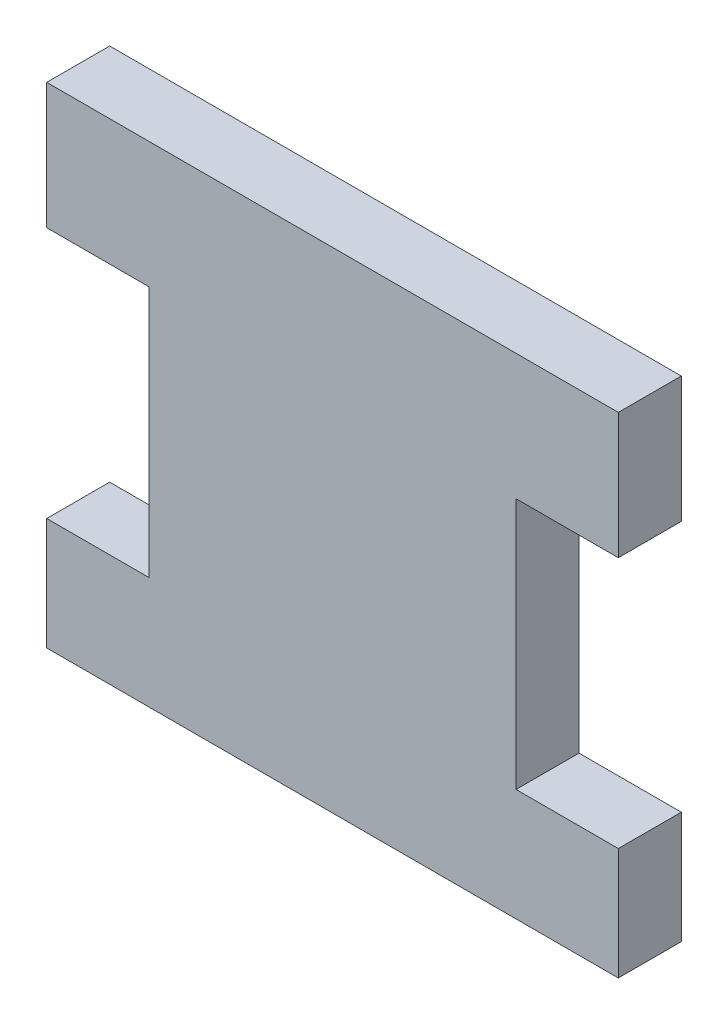
ISO-10303-21;
HEADER;
FILE_DESCRIPTION(('STEP AP214'),'2;1');
FILE_NAME('part.step','',(''),(''),'','','');
FILE_SCHEMA(('AUTOMOTIVE_DESIGN { 1 0 10303 214 1 1 1 1 }'));
ENDSEC;
DATA;
#1=APPLICATION_CONTEXT('core data for automotive mechanical design processes');
#2=APPLICATION_PROTOCOL_DEFINITION('international standard','automotive_design',2000,#1);
#3=PRODUCT_CONTEXT('',#1,'mechanical');
#4=PRODUCT('Part','Part','',(#3));
#5=PRODUCT_RELATED_PRODUCT_CATEGORY('part','',(#4));
#6=PRODUCT_DEFINITION_FORMATION('','',#4);
#7=PRODUCT_DEFINITION_CONTEXT('part definition',#1,'design');
#8=PRODUCT_DEFINITION('design','',#6,#7);
#9=PRODUCT_DEFINITION_SHAPE('','',#8);
#10=(LENGTH_UNIT() NAMED_UNIT(*) SI_UNIT(.MILLI.,.METRE.));
#11=(NAMED_UNIT(*) PLANE_ANGLE_UNIT() SI_UNIT($,.RADIAN.));
#12=(NAMED_UNIT(*) SI_UNIT($,.STERADIAN.) SOLID_ANGLE_UNIT());
#13=UNCERTAINTY_MEASURE_WITH_UNIT(LENGTH_MEASURE(1.E-05),#10,'distance_accuracy_value','');
#14=(GEOMETRIC_REPRESENTATION_CONTEXT(3) GLOBAL_UNCERTAINTY_ASSIGNED_CONTEXT((#13)) GLOBAL_UNIT_ASSIGNED_CONTEXT((#10,
#11,#12)) REPRESENTATION_CONTEXT('',''));
#15=CARTESIAN_POINT('',(0.,0.,0.));
#16=DIRECTION('',(0.,0.,1.));
#17=DIRECTION('',(1.,0.,0.));
#18=AXIS2_PLACEMENT_3D('',#15,#16,#17);
#19=CARTESIAN_POINT('',(1.135,-0.46875,0.25));
#20=DIRECTION('',(0.,-1.,0.));
#21=DIRECTION('',(0.,0.,-1.));
#22=AXIS2_PLACEMENT_3D('',#19,#20,#21);
#23=PLANE('',#22);
#24=DIRECTION('',(-1.,0.,0.));
#25=VECTOR('',#24,1.);
#26=CARTESIAN_POINT('',(1.135,-0.46875,0.));
#27=LINE('',#26,#25);
#28=CARTESIAN_POINT('',(1.135,-0.46875,0.));
#29=VERTEX_POINT('',#28);
#30=CARTESIAN_POINT('',(0.72875,-0.46875,0.));
#31=VERTEX_POINT('',#30);
#32=EDGE_CURVE('E164',#29,#31,#27,.T.);
#33=ORIENTED_EDGE('',*,*,#32,.T.);
#34=DIRECTION('',(0.,0.,-1.));
#35=VECTOR('',#34,1.);
#36=CARTESIAN_POINT('',(0.72875,-0.46875,0.25));
#37=LINE('',#36,#35);
#38=CARTESIAN_POINT('',(0.72875,-0.46875,0.25));
#39=VERTEX_POINT('',#38);
#40=EDGE_CURVE('E11',#39,#31,#37,.T.);
#41=ORIENTED_EDGE('',*,*,#40,.F.);
#42=DIRECTION('',(-1.,0.,0.));
#43=VECTOR('',#42,1.);
#44=CARTESIAN_POINT('',(1.135,-0.46875,0.25));
#45=LINE('',#44,#43);
#46=CARTESIAN_POINT('',(1.135,-0.46875,0.25));
#47=VERTEX_POINT('',#46);
#48=EDGE_CURVE('E198',#47,#39,#45,.T.);
#49=ORIENTED_EDGE('',*,*,#48,.F.);
#50=DIRECTION('',(0.,0.,-1.));
#51=VECTOR('',#50,1.);
#52=CARTESIAN_POINT('',(1.135,-0.46875,0.25));
#53=LINE('',#52,#51);
#54=EDGE_CURVE('E160',#47,#29,#53,.T.);
#55=ORIENTED_EDGE('',*,*,#54,.T.);
#56=EDGE_LOOP('',(#33,#41,#49,#55));
#57=FACE_BOUND('',#56,.T.);
#58=ADVANCED_FACE('F39',(#57),#23,.F.);
#59=CARTESIAN_POINT('',(0.72875,-0.46875,0.25));
#60=DIRECTION('',(-1.,0.,0.));
#61=DIRECTION('',(0.,0.,1.));
#62=AXIS2_PLACEMENT_3D('',#59,#60,#61);
#63=PLANE('',#62);
#64=DIRECTION('',(0.,1.,0.));
#65=VECTOR('',#64,1.);
#66=CARTESIAN_POINT('',(0.72875,-0.46875,0.));
#67=LINE('',#66,#65);
#68=CARTESIAN_POINT('',(0.72875,0.53125,0.));
#69=VERTEX_POINT('',#68);
#70=EDGE_CURVE('E168',#31,#69,#67,.T.);
#71=ORIENTED_EDGE('',*,*,#70,.T.);
#72=DIRECTION('',(0.,0.,-1.));
#73=VECTOR('',#72,1.);
#74=CARTESIAN_POINT('',(0.72875,0.53125,0.25));
#75=LINE('',#74,#73);
#76=CARTESIAN_POINT('',(0.72875,0.53125,0.25));
#77=VERTEX_POINT('',#76);
#78=EDGE_CURVE('E48',#77,#69,#75,.T.);
#79=ORIENTED_EDGE('',*,*,#78,.F.);
#80=DIRECTION('',(0.,1.,0.));
#81=VECTOR('',#80,1.);
#82=CARTESIAN_POINT('',(0.72875,-0.46875,0.25));
#83=LINE('',#82,#81);
#84=EDGE_CURVE('E111',#39,#77,#83,.T.);
#85=ORIENTED_EDGE('',*,*,#84,.F.);
#86=ORIENTED_EDGE('',*,*,#40,.T.);
#87=EDGE_LOOP('',(#71,#79,#85,#86));
#88=FACE_BOUND('',#87,.T.);
#89=ADVANCED_FACE('F292',(#88),#63,.F.);
#90=CARTESIAN_POINT('',(0.72875,0.53125,0.25));
#91=DIRECTION('',(0.,1.,0.));
#92=DIRECTION('',(0.,0.,1.));
#93=AXIS2_PLACEMENT_3D('',#90,#91,#92);
#94=PLANE('',#93);
#95=DIRECTION('',(1.,0.,0.));
#96=VECTOR('',#95,1.);
#97=CARTESIAN_POINT('',(0.72875,0.53125,0.));
#98=LINE('',#97,#96);
#99=CARTESIAN_POINT('',(1.135,0.53125,0.));
#100=VERTEX_POINT('',#99);
#101=EDGE_CURVE('E171',#69,#100,#98,.T.);
#102=ORIENTED_EDGE('',*,*,#101,.T.);
#103=DIRECTION('',(0.,0.,-1.));
#104=VECTOR('',#103,1.);
#105=CARTESIAN_POINT('',(1.135,0.53125,0.25));
#106=LINE('',#105,#104);
#107=CARTESIAN_POINT('',(1.135,0.53125,0.25));
#108=VERTEX_POINT('',#107);
#109=EDGE_CURVE('E225',#108,#100,#106,.T.);
#110=ORIENTED_EDGE('',*,*,#109,.F.);
#111=DIRECTION('',(1.,0.,0.));
#112=VECTOR('',#111,1.);
#113=CARTESIAN_POINT('',(0.72875,0.53125,0.25));
#114=LINE('',#113,#112);
#115=EDGE_CURVE('E235',#77,#108,#114,.T.);
#116=ORIENTED_EDGE('',*,*,#115,.F.);
#117=ORIENTED_EDGE('',*,*,#78,.T.);
#118=EDGE_LOOP('',(#102,#110,#116,#117));
#119=FACE_BOUND('',#118,.T.);
#120=ADVANCED_FACE('F233',(#119),#94,.F.);
#121=CARTESIAN_POINT('',(1.135,0.53125,0.25));
#122=DIRECTION('',(-1.,0.,0.));
#123=DIRECTION('',(0.,0.,1.));
#124=AXIS2_PLACEMENT_3D('',#121,#122,#123);
#125=PLANE('',#124);
#126=DIRECTION('',(0.,1.,0.));
#127=VECTOR('',#126,1.);
#128=CARTESIAN_POINT('',(1.135,0.53125,0.));
#129=LINE('',#128,#127);
#130=CARTESIAN_POINT('',(1.135,1.03125,0.));
#131=VERTEX_POINT('',#130);
#132=EDGE_CURVE('E174',#100,#131,#129,.T.);
#133=ORIENTED_EDGE('',*,*,#132,.T.);
#134=DIRECTION('',(0.,0.,-1.));
#135=VECTOR('',#134,1.);
#136=CARTESIAN_POINT('',(1.135,1.03125,0.25));
#137=LINE('',#136,#135);
#138=CARTESIAN_POINT('',(1.135,1.03125,0.25));
#139=VERTEX_POINT('',#138);
#140=EDGE_CURVE('E221',#139,#131,#137,.T.);
#141=ORIENTED_EDGE('',*,*,#140,.F.);
#142=DIRECTION('',(0.,1.,0.));
#143=VECTOR('',#142,1.);
#144=CARTESIAN_POINT('',(1.135,0.53125,0.25));
#145=LINE('',#144,#143);
#146=EDGE_CURVE('E254',#108,#139,#145,.T.);
#147=ORIENTED_EDGE('',*,*,#146,.F.);
#148=ORIENTED_EDGE('',*,*,#109,.T.);
#149=EDGE_LOOP('',(#133,#141,#147,#148));
#150=FACE_BOUND('',#149,.T.);
#151=ADVANCED_FACE('F244',(#150),#125,.F.);
#152=CARTESIAN_POINT('',(-1.135,1.03125,0.25));
#153=DIRECTION('',(0.,-1.,0.));
#154=DIRECTION('',(0.,0.,-1.));
#155=AXIS2_PLACEMENT_3D('',#152,#153,#154);
#156=PLANE('',#155);
#157=DIRECTION('',(-1.,0.,0.));
#158=VECTOR('',#157,1.);
#159=CARTESIAN_POINT('',(-1.135,1.03125,0.));
#160=LINE('',#159,#158);
#161=CARTESIAN_POINT('',(-1.135,1.03125,0.));
#162=VERTEX_POINT('',#161);
#163=EDGE_CURVE('E177',#131,#162,#160,.T.);
#164=ORIENTED_EDGE('',*,*,#163,.T.);
#165=DIRECTION('',(0.,0.,-1.));
#166=VECTOR('',#165,1.);
#167=CARTESIAN_POINT('',(-1.135,1.03125,0.25));
#168=LINE('',#167,#166);
#169=CARTESIAN_POINT('',(-1.135,1.03125,0.25));
#170=VERTEX_POINT('',#169);
#171=EDGE_CURVE('E217',#170,#162,#168,.T.);
#172=ORIENTED_EDGE('',*,*,#171,.F.);
#173=DIRECTION('',(-1.,0.,0.));
#174=VECTOR('',#173,1.);
#175=CARTESIAN_POINT('',(-1.135,1.03125,0.25));
#176=LINE('',#175,#174);
#177=EDGE_CURVE('E250',#139,#170,#176,.T.);
#178=ORIENTED_EDGE('',*,*,#177,.F.);
#179=ORIENTED_EDGE('',*,*,#140,.T.);
#180=EDGE_LOOP('',(#164,#172,#178,#179));
#181=FACE_BOUND('',#180,.T.);
#182=ADVANCED_FACE('F248',(#181),#156,.F.);
#183=CARTESIAN_POINT('',(-1.135,0.53125,0.25));
#184=DIRECTION('',(1.,0.,0.));
#185=DIRECTION('',(0.,0.,-1.));
#186=AXIS2_PLACEMENT_3D('',#183,#184,#185);
#187=PLANE('',#186);
#188=DIRECTION('',(0.,-1.,0.));
#189=VECTOR('',#188,1.);
#190=CARTESIAN_POINT('',(-1.135,0.53125,0.));
#191=LINE('',#190,#189);
#192=CARTESIAN_POINT('',(-1.135,0.53125,0.));
#193=VERTEX_POINT('',#192);
#194=EDGE_CURVE('E180',#162,#193,#191,.T.);
#195=ORIENTED_EDGE('',*,*,#194,.T.);
#196=DIRECTION('',(0.,0.,-1.));
#197=VECTOR('',#196,1.);
#198=CARTESIAN_POINT('',(-1.135,0.53125,0.25));
#199=LINE('',#198,#197);
#200=CARTESIAN_POINT('',(-1.135,0.53125,0.25));
#201=VERTEX_POINT('',#200);
#202=EDGE_CURVE('E213',#201,#193,#199,.T.);
#203=ORIENTED_EDGE('',*,*,#202,.F.);
#204=DIRECTION('',(0.,-1.,0.));
#205=VECTOR('',#204,1.);
#206=CARTESIAN_POINT('',(-1.135,0.53125,0.25));
#207=LINE('',#206,#205);
#208=EDGE_CURVE('E253',#170,#201,#207,.T.);
#209=ORIENTED_EDGE('',*,*,#208,.F.);
#210=ORIENTED_EDGE('',*,*,#171,.T.);
#211=EDGE_LOOP('',(#195,#203,#209,#210));
#212=FACE_BOUND('',#211,.T.);
#213=ADVANCED_FACE('F305',(#212),#187,.F.);
#214=CARTESIAN_POINT('',(-0.72875,0.53125,0.25));
#215=DIRECTION('',(0.,1.,0.));
#216=DIRECTION('',(0.,0.,1.));
#217=AXIS2_PLACEMENT_3D('',#214,#215,#216);
#218=PLANE('',#217);
#219=DIRECTION('',(1.,0.,0.));
#220=VECTOR('',#219,1.);
#221=CARTESIAN_POINT('',(-0.72875,0.53125,0.));
#222=LINE('',#221,#220);
#223=CARTESIAN_POINT('',(-0.72875,0.53125,0.));
#224=VERTEX_POINT('',#223);
#225=EDGE_CURVE('E183',#193,#224,#222,.T.);
#226=ORIENTED_EDGE('',*,*,#225,.T.);
#227=DIRECTION('',(0.,0.,-1.));
#228=VECTOR('',#227,1.);
#229=CARTESIAN_POINT('',(-0.72875,0.53125,0.25));
#230=LINE('',#229,#228);
#231=CARTESIAN_POINT('',(-0.72875,0.53125,0.25));
#232=VERTEX_POINT('',#231);
#233=EDGE_CURVE('E209',#232,#224,#230,.T.);
#234=ORIENTED_EDGE('',*,*,#233,.F.);
#235=DIRECTION('',(1.,0.,0.));
#236=VECTOR('',#235,1.);
#237=CARTESIAN_POINT('',(-0.72875,0.53125,0.25));
#238=LINE('',#237,#236);
#239=EDGE_CURVE('E258',#201,#232,#238,.T.);
#240=ORIENTED_EDGE('',*,*,#239,.F.);
#241=ORIENTED_EDGE('',*,*,#202,.T.);
#242=EDGE_LOOP('',(#226,#234,#240,#241));
#243=FACE_BOUND('',#242,.T.);
#244=ADVANCED_FACE('F308',(#243),#218,.F.);
#245=CARTESIAN_POINT('',(-0.72875,-0.46875,0.25));
#246=DIRECTION('',(1.,0.,0.));
#247=DIRECTION('',(0.,0.,-1.));
#248=AXIS2_PLACEMENT_3D('',#245,#246,#247);
#249=PLANE('',#248);
#250=DIRECTION('',(0.,-1.,0.));
#251=VECTOR('',#250,1.);
#252=CARTESIAN_POINT('',(-0.72875,-0.46875,0.));
#253=LINE('',#252,#251);
#254=CARTESIAN_POINT('',(-0.72875,-0.46875,0.));
#255=VERTEX_POINT('',#254);
#256=EDGE_CURVE('E186',#224,#255,#253,.T.);
#257=ORIENTED_EDGE('',*,*,#256,.T.);
#258=DIRECTION('',(0.,0.,-1.));
#259=VECTOR('',#258,1.);
#260=CARTESIAN_POINT('',(-0.72875,-0.46875,0.25));
#261=LINE('',#260,#259);
#262=CARTESIAN_POINT('',(-0.72875,-0.46875,0.25));
#263=VERTEX_POINT('',#262);
#264=EDGE_CURVE('E205',#263,#255,#261,.T.);
#265=ORIENTED_EDGE('',*,*,#264,.F.);
#266=DIRECTION('',(0.,-1.,0.));
#267=VECTOR('',#266,1.);
#268=CARTESIAN_POINT('',(-0.72875,-0.46875,0.25));
#269=LINE('',#268,#267);
#270=EDGE_CURVE('E265',#232,#263,#269,.T.);
#271=ORIENTED_EDGE('',*,*,#270,.F.);
#272=ORIENTED_EDGE('',*,*,#233,.T.);
#273=EDGE_LOOP('',(#257,#265,#271,#272));
#274=FACE_BOUND('',#273,.T.);
#275=ADVANCED_FACE('F273',(#274),#249,.F.);
#276=CARTESIAN_POINT('',(-1.135,-0.46875,0.25));
#277=DIRECTION('',(0.,-1.,0.));
#278=DIRECTION('',(0.,0.,-1.));
#279=AXIS2_PLACEMENT_3D('',#276,#277,#278);
#280=PLANE('',#279);
#281=DIRECTION('',(-1.,0.,0.));
#282=VECTOR('',#281,1.);
#283=CARTESIAN_POINT('',(-1.135,-0.46875,0.));
#284=LINE('',#283,#282);
#285=CARTESIAN_POINT('',(-1.135,-0.46875,0.));
#286=VERTEX_POINT('',#285);
#287=EDGE_CURVE('E189',#255,#286,#284,.T.);
#288=ORIENTED_EDGE('',*,*,#287,.T.);
#289=DIRECTION('',(0.,0.,-1.));
#290=VECTOR('',#289,1.);
#291=CARTESIAN_POINT('',(-1.135,-0.46875,0.25));
#292=LINE('',#291,#290);
#293=CARTESIAN_POINT('',(-1.135,-0.46875,0.25));
#294=VERTEX_POINT('',#293);
#295=EDGE_CURVE('E153',#294,#286,#292,.T.);
#296=ORIENTED_EDGE('',*,*,#295,.F.);
#297=DIRECTION('',(-1.,0.,0.));
#298=VECTOR('',#297,1.);
#299=CARTESIAN_POINT('',(-1.135,-0.46875,0.25));
#300=LINE('',#299,#298);
#301=EDGE_CURVE('E142',#263,#294,#300,.T.);
#302=ORIENTED_EDGE('',*,*,#301,.F.);
#303=ORIENTED_EDGE('',*,*,#264,.T.);
#304=EDGE_LOOP('',(#288,#296,#302,#303));
#305=FACE_BOUND('',#304,.T.);
#306=ADVANCED_FACE('F277',(#305),#280,.F.);
#307=CARTESIAN_POINT('',(-1.135,-0.914062499999824,0.25));
#308=DIRECTION('',(1.,0.,0.));
#309=DIRECTION('',(0.,0.,-1.));
#310=AXIS2_PLACEMENT_3D('',#307,#308,#309);
#311=PLANE('',#310);
#312=DIRECTION('',(0.,-1.,0.));
#313=VECTOR('',#312,1.);
#314=CARTESIAN_POINT('',(-1.135,-0.914062499999824,0.));
#315=LINE('',#314,#313);
#316=CARTESIAN_POINT('',(-1.135,-0.914062499999824,0.));
#317=VERTEX_POINT('',#316);
#318=EDGE_CURVE('E151',#286,#317,#315,.T.);
#319=ORIENTED_EDGE('',*,*,#318,.T.);
#320=DIRECTION('',(0.,0.,-1.));
#321=VECTOR('',#320,1.);
#322=CARTESIAN_POINT('',(-1.135,-0.914062499999824,0.25));
#323=LINE('',#322,#321);
#324=CARTESIAN_POINT('',(-1.135,-0.914062499999824,0.25));
#325=VERTEX_POINT('',#324);
#326=EDGE_CURVE('E148',#325,#317,#323,.T.);
#327=ORIENTED_EDGE('',*,*,#326,.F.);
#328=DIRECTION('',(0.,-1.,0.));
#329=VECTOR('',#328,1.);
#330=CARTESIAN_POINT('',(-1.135,-0.914062499999824,0.25));
#331=LINE('',#330,#329);
#332=EDGE_CURVE('E136',#294,#325,#331,.T.);
#333=ORIENTED_EDGE('',*,*,#332,.F.);
#334=ORIENTED_EDGE('',*,*,#295,.T.);
#335=EDGE_LOOP('',(#319,#327,#333,#334));
#336=FACE_BOUND('',#335,.T.);
#337=ADVANCED_FACE('F149',(#336),#311,.F.);
#338=CARTESIAN_POINT('',(1.135,-0.914062499999824,0.25));
#339=DIRECTION('',(0.,1.,0.));
#340=DIRECTION('',(0.,0.,1.));
#341=AXIS2_PLACEMENT_3D('',#338,#339,#340);
#342=PLANE('',#341);
#343=DIRECTION('',(1.,0.,0.));
#344=VECTOR('',#343,1.);
#345=CARTESIAN_POINT('',(1.135,-0.914062499999824,0.));
#346=LINE('',#345,#344);
#347=CARTESIAN_POINT('',(1.135,-0.914062499999824,0.));
#348=VERTEX_POINT('',#347);
#349=EDGE_CURVE('E97',#317,#348,#346,.T.);
#350=ORIENTED_EDGE('',*,*,#349,.T.);
#351=DIRECTION('',(0.,0.,-1.));
#352=VECTOR('',#351,1.);
#353=CARTESIAN_POINT('',(1.135,-0.914062499999824,0.25));
#354=LINE('',#353,#352);
#355=CARTESIAN_POINT('',(1.135,-0.914062499999824,0.25));
#356=VERTEX_POINT('',#355);
#357=EDGE_CURVE('E154',#356,#348,#354,.T.);
#358=ORIENTED_EDGE('',*,*,#357,.F.);
#359=DIRECTION('',(1.,0.,0.));
#360=VECTOR('',#359,1.);
#361=CARTESIAN_POINT('',(1.135,-0.914062499999824,0.25));
#362=LINE('',#361,#360);
#363=EDGE_CURVE('E140',#325,#356,#362,.T.);
#364=ORIENTED_EDGE('',*,*,#363,.F.);
#365=ORIENTED_EDGE('',*,*,#326,.T.);
#366=EDGE_LOOP('',(#350,#358,#364,#365));
#367=FACE_BOUND('',#366,.T.);
#368=ADVANCED_FACE('F156',(#367),#342,.F.);
#369=CARTESIAN_POINT('',(1.135,-0.914062499999824,0.25));
#370=DIRECTION('',(-1.,0.,0.));
#371=DIRECTION('',(0.,0.,1.));
#372=AXIS2_PLACEMENT_3D('',#369,#370,#371);
#373=PLANE('',#372);
#374=DIRECTION('',(0.,1.,0.));
#375=VECTOR('',#374,1.);
#376=CARTESIAN_POINT('',(1.135,-0.914062499999824,0.));
#377=LINE('',#376,#375);
#378=EDGE_CURVE('E103',#348,#29,#377,.T.);
#379=ORIENTED_EDGE('',*,*,#378,.T.);
#380=ORIENTED_EDGE('',*,*,#54,.F.);
#381=DIRECTION('',(0.,1.,0.));
#382=VECTOR('',#381,1.);
#383=CARTESIAN_POINT('',(1.135,-0.914062499999824,0.25));
#384=LINE('',#383,#382);
#385=EDGE_CURVE('E56',#356,#47,#384,.T.);
#386=ORIENTED_EDGE('',*,*,#385,.F.);
#387=ORIENTED_EDGE('',*,*,#357,.T.);
#388=EDGE_LOOP('',(#379,#380,#386,#387));
#389=FACE_BOUND('',#388,.T.);
#390=ADVANCED_FACE('F281',(#389),#373,.F.);
#391=CARTESIAN_POINT('',(0.,0.,0.25));
#392=DIRECTION('',(0.,0.,-1.));
#393=DIRECTION('',(-1.,0.,0.));
#394=AXIS2_PLACEMENT_3D('',#391,#392,#393);
#395=PLANE('',#394);
#396=ORIENTED_EDGE('',*,*,#48,.T.);
#397=ORIENTED_EDGE('',*,*,#84,.T.);
#398=ORIENTED_EDGE('',*,*,#115,.T.);
#399=ORIENTED_EDGE('',*,*,#146,.T.);
#400=ORIENTED_EDGE('',*,*,#177,.T.);
#401=ORIENTED_EDGE('',*,*,#208,.T.);
#402=ORIENTED_EDGE('',*,*,#239,.T.);
#403=ORIENTED_EDGE('',*,*,#270,.T.);
#404=ORIENTED_EDGE('',*,*,#301,.T.);
#405=ORIENTED_EDGE('',*,*,#332,.T.);
#406=ORIENTED_EDGE('',*,*,#363,.T.);
#407=ORIENTED_EDGE('',*,*,#385,.T.);
#408=EDGE_LOOP('',(#396,#397,#398,#399,#400,#401,#402,#403,#404,#405,#406,#407));
#409=FACE_BOUND('',#408,.T.);
#410=ADVANCED_FACE('F138',(#409),#395,.F.);
#411=CARTESIAN_POINT('',(0.,0.,0.));
#412=DIRECTION('',(0.,0.,-1.));
#413=DIRECTION('',(-1.,0.,0.));
#414=AXIS2_PLACEMENT_3D('',#411,#412,#413);
#415=PLANE('',#414);
#416=ORIENTED_EDGE('',*,*,#32,.F.);
#417=ORIENTED_EDGE('',*,*,#378,.F.);
#418=ORIENTED_EDGE('',*,*,#349,.F.);
#419=ORIENTED_EDGE('',*,*,#318,.F.);
#420=ORIENTED_EDGE('',*,*,#287,.F.);
#421=ORIENTED_EDGE('',*,*,#256,.F.);
#422=ORIENTED_EDGE('',*,*,#225,.F.);
#423=ORIENTED_EDGE('',*,*,#194,.F.);
#424=ORIENTED_EDGE('',*,*,#163,.F.);
#425=ORIENTED_EDGE('',*,*,#132,.F.);
#426=ORIENTED_EDGE('',*,*,#101,.F.);
#427=ORIENTED_EDGE('',*,*,#70,.F.);
#428=EDGE_LOOP('',(#416,#417,#418,#419,#420,#421,#422,#423,#424,#425,#426,#427));
#429=FACE_BOUND('',#428,.T.);
#430=ADVANCED_FACE('F239',(#429),#415,.T.);
#431=CLOSED_SHELL('',(#58,#89,#120,#151,#182,#213,#244,#275,#306,#337,#368,#390,#410,#430));
#432=MANIFOLD_SOLID_BREP('B2',#431);
#433=ADVANCED_BREP_SHAPE_REPRESENTATION('',(#18,#432),#14);
#434=SHAPE_DEFINITION_REPRESENTATION(#9,#433);
ENDSEC;
END-ISO-10303-21;
